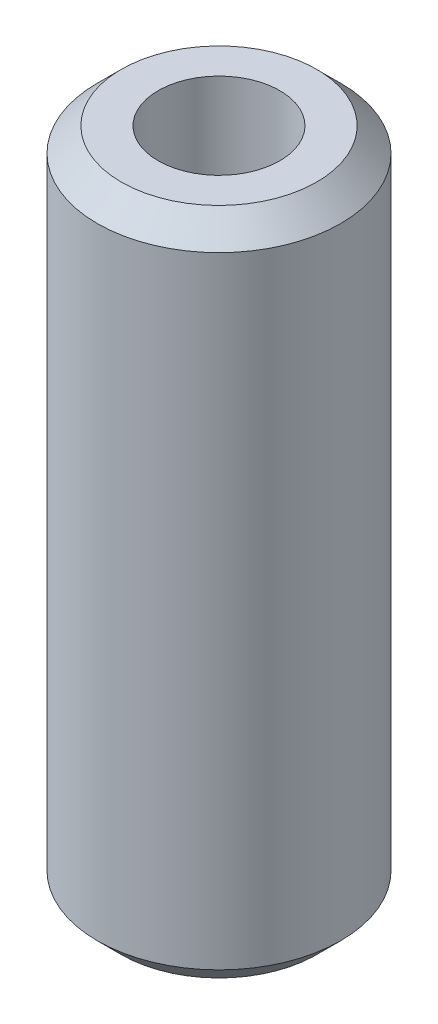
ISO-10303-21;
HEADER;
FILE_DESCRIPTION(('STEP AP214'),'2;1');
FILE_NAME('part.step','',(''),(''),'','','');
FILE_SCHEMA(('AUTOMOTIVE_DESIGN { 1 0 10303 214 1 1 1 1 }'));
ENDSEC;
DATA;
#1=APPLICATION_CONTEXT('core data for automotive mechanical design processes');
#2=APPLICATION_PROTOCOL_DEFINITION('international standard','automotive_design',2000,#1);
#3=PRODUCT_CONTEXT('',#1,'mechanical');
#4=PRODUCT('Part','Part','',(#3));
#5=PRODUCT_RELATED_PRODUCT_CATEGORY('part','',(#4));
#6=PRODUCT_DEFINITION_FORMATION('','',#4);
#7=PRODUCT_DEFINITION_CONTEXT('part definition',#1,'design');
#8=PRODUCT_DEFINITION('design','',#6,#7);
#9=PRODUCT_DEFINITION_SHAPE('','',#8);
#10=(LENGTH_UNIT() NAMED_UNIT(*) SI_UNIT(.MILLI.,.METRE.));
#11=(NAMED_UNIT(*) PLANE_ANGLE_UNIT() SI_UNIT($,.RADIAN.));
#12=(NAMED_UNIT(*) SI_UNIT($,.STERADIAN.) SOLID_ANGLE_UNIT());
#13=UNCERTAINTY_MEASURE_WITH_UNIT(LENGTH_MEASURE(1.E-05),#10,'distance_accuracy_value','');
#14=(GEOMETRIC_REPRESENTATION_CONTEXT(3) GLOBAL_UNCERTAINTY_ASSIGNED_CONTEXT((#13)) GLOBAL_UNIT_ASSIGNED_CONTEXT((#10,
#11,#12)) REPRESENTATION_CONTEXT('',''));
#15=CARTESIAN_POINT('',(0.,0.,0.));
#16=DIRECTION('',(0.,0.,1.));
#17=DIRECTION('',(1.,0.,0.));
#18=AXIS2_PLACEMENT_3D('',#15,#16,#17);
#19=CARTESIAN_POINT('',(0.,34.925,0.));
#20=DIRECTION('',(0.,1.,0.));
#21=DIRECTION('',(0.,0.,1.));
#22=AXIS2_PLACEMENT_3D('',#19,#20,#21);
#23=PLANE('',#22);
#24=CARTESIAN_POINT('',(0.,34.925,0.));
#25=DIRECTION('',(0.,1.,0.));
#26=DIRECTION('',(0.,0.,1.));
#27=AXIS2_PLACEMENT_3D('',#24,#25,#26);
#28=CIRCLE('',#27,10.2);
#29=CARTESIAN_POINT('',(0.,34.925,10.2));
#30=VERTEX_POINT('',#29);
#31=EDGE_CURVE('E10',#30,#30,#28,.T.);
#32=ORIENTED_EDGE('',*,*,#31,.T.);
#33=EDGE_LOOP('',(#32));
#34=FACE_BOUND('',#33,.T.);
#35=CARTESIAN_POINT('',(0.,34.925,0.));
#36=DIRECTION('',(0.,1.,0.));
#37=DIRECTION('',(0.,0.,1.));
#38=AXIS2_PLACEMENT_3D('',#35,#36,#37);
#39=CIRCLE('',#38,6.35);
#40=CARTESIAN_POINT('',(0.,34.925,6.35));
#41=VERTEX_POINT('',#40);
#42=EDGE_CURVE('E50',#41,#41,#39,.T.);
#43=ORIENTED_EDGE('',*,*,#42,.F.);
#44=EDGE_LOOP('',(#43));
#45=FACE_BOUND('',#44,.T.);
#46=ADVANCED_FACE('F30',(#34,#45),#23,.T.);
#47=CARTESIAN_POINT('',(0.,-34.925,0.));
#48=DIRECTION('',(0.,1.,0.));
#49=DIRECTION('',(0.,0.,1.));
#50=AXIS2_PLACEMENT_3D('',#47,#48,#49);
#51=PLANE('',#50);
#52=CARTESIAN_POINT('',(0.,-34.925,0.));
#53=DIRECTION('',(0.,1.,0.));
#54=DIRECTION('',(0.,0.,1.));
#55=AXIS2_PLACEMENT_3D('',#52,#53,#54);
#56=CIRCLE('',#55,10.2);
#57=CARTESIAN_POINT('',(0.,-34.925,10.2));
#58=VERTEX_POINT('',#57);
#59=EDGE_CURVE('E37',#58,#58,#56,.F.);
#60=ORIENTED_EDGE('',*,*,#59,.T.);
#61=EDGE_LOOP('',(#60));
#62=FACE_BOUND('',#61,.T.);
#63=CARTESIAN_POINT('',(0.,-34.925,0.));
#64=DIRECTION('',(0.,1.,0.));
#65=DIRECTION('',(0.,0.,1.));
#66=AXIS2_PLACEMENT_3D('',#63,#64,#65);
#67=CIRCLE('',#66,6.35);
#68=CARTESIAN_POINT('',(0.,-34.925,6.35));
#69=VERTEX_POINT('',#68);
#70=EDGE_CURVE('E51',#69,#69,#67,.T.);
#71=ORIENTED_EDGE('',*,*,#70,.T.);
#72=EDGE_LOOP('',(#71));
#73=FACE_BOUND('',#72,.T.);
#74=ADVANCED_FACE('F61',(#62,#73),#51,.F.);
#75=CARTESIAN_POINT('',(0.,34.925,0.));
#76=DIRECTION('',(0.,-1.,0.));
#77=DIRECTION('',(0.,0.,-1.));
#78=AXIS2_PLACEMENT_3D('',#75,#76,#77);
#79=CYLINDRICAL_SURFACE('',#78,12.7);
#80=CARTESIAN_POINT('',(0.,-32.425,0.));
#81=DIRECTION('',(0.,1.,0.));
#82=DIRECTION('',(0.,0.,1.));
#83=AXIS2_PLACEMENT_3D('',#80,#81,#82);
#84=CIRCLE('',#83,12.7);
#85=CARTESIAN_POINT('',(0.,-32.425,12.7));
#86=VERTEX_POINT('',#85);
#87=EDGE_CURVE('E41',#86,#86,#84,.T.);
#88=ORIENTED_EDGE('',*,*,#87,.T.);
#89=EDGE_LOOP('',(#88));
#90=FACE_BOUND('',#89,.T.);
#91=CARTESIAN_POINT('',(0.,32.425,0.));
#92=DIRECTION('',(0.,1.,0.));
#93=DIRECTION('',(0.,0.,1.));
#94=AXIS2_PLACEMENT_3D('',#91,#92,#93);
#95=CIRCLE('',#94,12.7);
#96=CARTESIAN_POINT('',(0.,32.425,12.7));
#97=VERTEX_POINT('',#96);
#98=EDGE_CURVE('E45',#97,#97,#95,.F.);
#99=ORIENTED_EDGE('',*,*,#98,.T.);
#100=EDGE_LOOP('',(#99));
#101=FACE_BOUND('',#100,.T.);
#102=ADVANCED_FACE('F66',(#90,#101),#79,.T.);
#103=CARTESIAN_POINT('',(0.,34.925,0.));
#104=DIRECTION('',(0.,-1.,0.));
#105=DIRECTION('',(0.,0.,-1.));
#106=AXIS2_PLACEMENT_3D('',#103,#104,#105);
#107=CYLINDRICAL_SURFACE('',#106,6.35);
#108=ORIENTED_EDGE('',*,*,#42,.T.);
#109=EDGE_LOOP('',(#108));
#110=FACE_BOUND('',#109,.T.);
#111=ORIENTED_EDGE('',*,*,#70,.F.);
#112=EDGE_LOOP('',(#111));
#113=FACE_BOUND('',#112,.T.);
#114=ADVANCED_FACE('F57',(#110,#113),#107,.F.);
#115=CARTESIAN_POINT('',(0.,-32.425,0.));
#116=DIRECTION('',(0.,1.,0.));
#117=DIRECTION('',(0.,0.,1.));
#118=AXIS2_PLACEMENT_3D('',#115,#116,#117);
#119=CONICAL_SURFACE('',#118,12.7,0.785398163397449);
#120=ORIENTED_EDGE('',*,*,#59,.F.);
#121=EDGE_LOOP('',(#120));
#122=FACE_BOUND('',#121,.T.);
#123=ORIENTED_EDGE('',*,*,#87,.F.);
#124=EDGE_LOOP('',(#123));
#125=FACE_BOUND('',#124,.T.);
#126=ADVANCED_FACE('F72',(#122,#125),#119,.T.);
#127=CARTESIAN_POINT('',(0.,34.925,0.));
#128=DIRECTION('',(0.,-1.,0.));
#129=DIRECTION('',(0.,0.,-1.));
#130=AXIS2_PLACEMENT_3D('',#127,#128,#129);
#131=CONICAL_SURFACE('',#130,10.2,0.785398163397446);
#132=ORIENTED_EDGE('',*,*,#98,.F.);
#133=EDGE_LOOP('',(#132));
#134=FACE_BOUND('',#133,.T.);
#135=ORIENTED_EDGE('',*,*,#31,.F.);
#136=EDGE_LOOP('',(#135));
#137=FACE_BOUND('',#136,.T.);
#138=ADVANCED_FACE('F32',(#134,#137),#131,.T.);
#139=CLOSED_SHELL('',(#46,#74,#102,#114,#126,#138));
#140=MANIFOLD_SOLID_BREP('B2',#139);
#141=ADVANCED_BREP_SHAPE_REPRESENTATION('',(#18,#140),#14);
#142=SHAPE_DEFINITION_REPRESENTATION(#9,#141);
ENDSEC;
END-ISO-10303-21;
